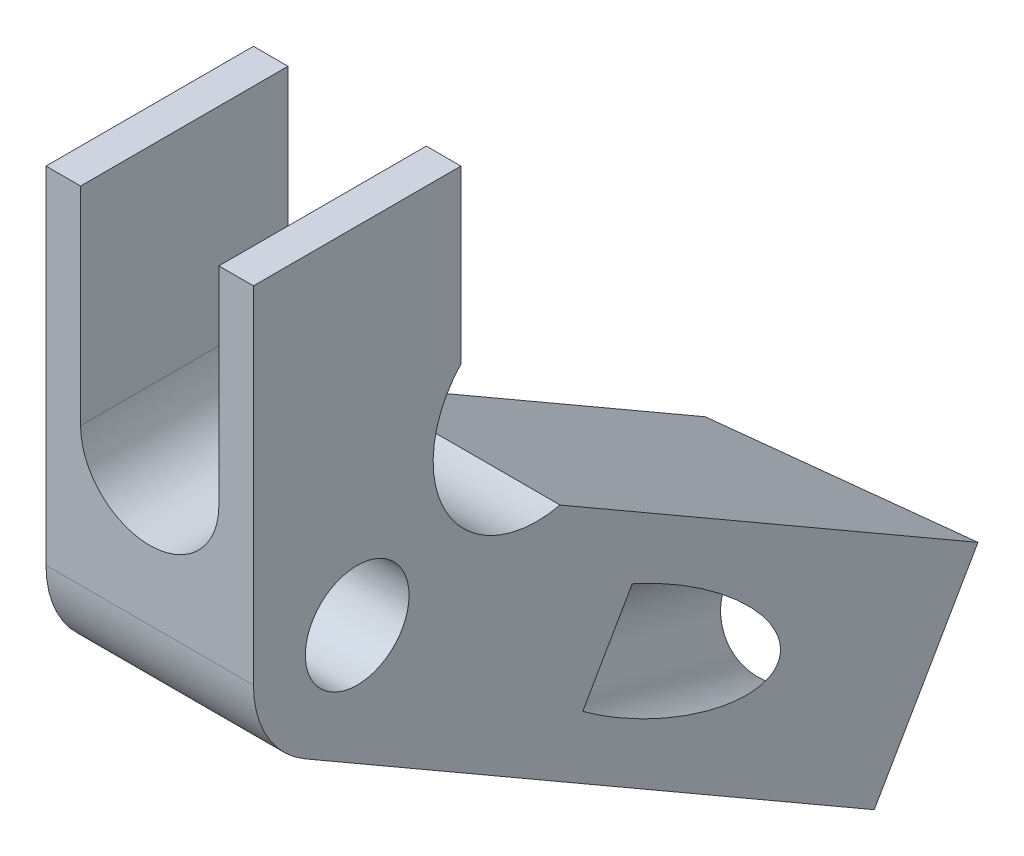
ISO-10303-21;
HEADER;
FILE_DESCRIPTION(('STEP AP214'),'2;1');
FILE_NAME('part.step','',(''),(''),'','','');
FILE_SCHEMA(('AUTOMOTIVE_DESIGN { 1 0 10303 214 1 1 1 1 }'));
ENDSEC;
DATA;
#1=APPLICATION_CONTEXT('core data for automotive mechanical design processes');
#2=APPLICATION_PROTOCOL_DEFINITION('international standard','automotive_design',2000,#1);
#3=PRODUCT_CONTEXT('',#1,'mechanical');
#4=PRODUCT('Part','Part','',(#3));
#5=PRODUCT_RELATED_PRODUCT_CATEGORY('part','',(#4));
#6=PRODUCT_DEFINITION_FORMATION('','',#4);
#7=PRODUCT_DEFINITION_CONTEXT('part definition',#1,'design');
#8=PRODUCT_DEFINITION('design','',#6,#7);
#9=PRODUCT_DEFINITION_SHAPE('','',#8);
#10=(LENGTH_UNIT() NAMED_UNIT(*) SI_UNIT(.MILLI.,.METRE.));
#11=(NAMED_UNIT(*) PLANE_ANGLE_UNIT() SI_UNIT($,.RADIAN.));
#12=(NAMED_UNIT(*) SI_UNIT($,.STERADIAN.) SOLID_ANGLE_UNIT());
#13=UNCERTAINTY_MEASURE_WITH_UNIT(LENGTH_MEASURE(1.E-05),#10,'distance_accuracy_value','');
#14=(GEOMETRIC_REPRESENTATION_CONTEXT(3) GLOBAL_UNCERTAINTY_ASSIGNED_CONTEXT((#13)) GLOBAL_UNIT_ASSIGNED_CONTEXT((#10,
#11,#12)) REPRESENTATION_CONTEXT('',''));
#15=CARTESIAN_POINT('',(0.,0.,0.));
#16=DIRECTION('',(0.,0.,1.));
#17=DIRECTION('',(1.,0.,0.));
#18=AXIS2_PLACEMENT_3D('',#15,#16,#17);
#19=CARTESIAN_POINT('',(-79.9999999999982,628.83201228621,-414.857743681078));
#20=DIRECTION('',(-1.11022302462414E-13,-1.,0.));
#21=DIRECTION('',(1.,-1.11022302462414E-13,0.));
#22=AXIS2_PLACEMENT_3D('',#19,#20,#21);
#23=PLANE('',#22);
#24=DIRECTION('',(1.,-1.11022302462414E-13,0.));
#25=VECTOR('',#24,1.);
#26=CARTESIAN_POINT('',(-79.9999999999982,628.83201228621,-408.857743681078));
#27=LINE('',#26,#25);
#28=CARTESIAN_POINT('',(-78.9999999999983,628.83201228621,-408.857743681078));
#29=VERTEX_POINT('',#28);
#30=CARTESIAN_POINT('',(-79.9999999999977,628.832012286211,-408.857743681078));
#31=VERTEX_POINT('',#30);
#32=EDGE_CURVE('E194',#29,#31,#27,.F.);
#33=ORIENTED_EDGE('',*,*,#32,.F.);
#34=DIRECTION('',(-1.48330561201754E-13,0.,1.));
#35=VECTOR('',#34,1.);
#36=CARTESIAN_POINT('',(-78.9999999999949,628.83201228621,-439.380974039878));
#37=LINE('',#36,#35);
#38=CARTESIAN_POINT('',(-78.9999999999985,628.83201228621,-414.857743681078));
#39=VERTEX_POINT('',#38);
#40=EDGE_CURVE('E133',#29,#39,#37,.F.);
#41=ORIENTED_EDGE('',*,*,#40,.T.);
#42=DIRECTION('',(1.,0.,0.));
#43=VECTOR('',#42,1.);
#44=CARTESIAN_POINT('',(-78.9999999999965,628.83201228621,-414.857743681077));
#45=LINE('',#44,#43);
#46=CARTESIAN_POINT('',(-79.9999999999977,628.832012286211,-414.857743681078));
#47=VERTEX_POINT('',#46);
#48=EDGE_CURVE('E192',#39,#47,#45,.F.);
#49=ORIENTED_EDGE('',*,*,#48,.T.);
#50=DIRECTION('',(0.,0.,-1.));
#51=VECTOR('',#50,1.);
#52=CARTESIAN_POINT('',(-79.9999999999977,628.832012286212,-411.857743681078));
#53=LINE('',#52,#51);
#54=EDGE_CURVE('E165',#47,#31,#53,.F.);
#55=ORIENTED_EDGE('',*,*,#54,.T.);
#56=EDGE_LOOP('',(#33,#41,#49,#55));
#57=FACE_BOUND('',#56,.T.);
#58=ADVANCED_FACE('F17',(#57),#23,.F.);
#59=CARTESIAN_POINT('',(-78.9999999999965,628.832012286212,-414.857743681077));
#60=DIRECTION('',(0.,0.,1.));
#61=DIRECTION('',(1.,0.,0.));
#62=AXIS2_PLACEMENT_3D('',#59,#60,#61);
#63=PLANE('',#62);
#64=DIRECTION('',(0.,1.,0.));
#65=VECTOR('',#64,1.);
#66=CARTESIAN_POINT('',(-79.9999999999977,624.832012286211,-414.857743681078));
#67=LINE('',#66,#65);
#68=CARTESIAN_POINT('',(-79.9999999999977,623.875762402111,-414.857743681078));
#69=VERTEX_POINT('',#68);
#70=EDGE_CURVE('E124',#69,#47,#67,.T.);
#71=ORIENTED_EDGE('',*,*,#70,.T.);
#72=ORIENTED_EDGE('',*,*,#48,.F.);
#73=DIRECTION('',(0.,1.,0.));
#74=VECTOR('',#73,1.);
#75=CARTESIAN_POINT('',(-78.9999999999983,623.307493233372,-414.857743681078));
#76=LINE('',#75,#74);
#77=CARTESIAN_POINT('',(-78.9999999999982,623.875762402111,-414.857743681078));
#78=VERTEX_POINT('',#77);
#79=EDGE_CURVE('E130',#39,#78,#76,.F.);
#80=ORIENTED_EDGE('',*,*,#79,.T.);
#81=DIRECTION('',(1.,0.,0.));
#82=VECTOR('',#81,1.);
#83=CARTESIAN_POINT('',(-78.9999999999965,623.875762402111,-414.857743681077));
#84=LINE('',#83,#82);
#85=EDGE_CURVE('E125',#69,#78,#84,.T.);
#86=ORIENTED_EDGE('',*,*,#85,.F.);
#87=EDGE_LOOP('',(#71,#72,#80,#86));
#88=FACE_BOUND('',#87,.T.);
#89=ADVANCED_FACE('F379',(#88),#63,.F.);
#90=CARTESIAN_POINT('',(-80.2786319766951,616.125564871041,-419.409040166123));
#91=DIRECTION('',(0.34202014332566,0.469846310392991,0.813797681349356));
#92=DIRECTION('',(0.,-0.866025403784417,0.500000000000038));
#93=AXIS2_PLACEMENT_3D('',#90,#91,#92);
#94=PLANE('',#93);
#95=CARTESIAN_POINT('',(-78.5797985667409,614.576430741539,-419.2286271322));
#96=DIRECTION('',(0.342020143325571,0.469846310392962,0.813797681349411));
#97=DIRECTION('',(0.,-0.866025403784445,0.499999999999989));
#98=AXIS2_PLACEMENT_3D('',#95,#96,#97);
#99=CIRCLE('',#98,1.50000000000003);
#100=CARTESIAN_POINT('',(-78.9999999999975,613.412929416189,-418.380278488423));
#101=VERTEX_POINT('',#100);
#102=CARTESIAN_POINT('',(-78.9999999999974,615.892872880991,-419.812074515402));
#103=VERTEX_POINT('',#102);
#104=EDGE_CURVE('E20',#101,#103,#99,.F.);
#105=ORIENTED_EDGE('',*,*,#104,.T.);
#106=DIRECTION('',(0.,-0.866025403784278,0.500000000000279));
#107=VECTOR('',#106,1.);
#108=CARTESIAN_POINT('',(-78.9999999999974,615.892872880991,-419.812074515403));
#109=LINE('',#108,#107);
#110=EDGE_CURVE('E122',#103,#101,#109,.T.);
#111=ORIENTED_EDGE('',*,*,#110,.T.);
#112=EDGE_LOOP('',(#105,#111));
#113=FACE_BOUND('',#112,.T.);
#114=ADVANCED_FACE('F121',(#113),#94,.F.);
#115=CARTESIAN_POINT('',(-82.5823875322111,609.077919340544,-428.752328244721));
#116=DIRECTION('',(0.342020143325571,0.469846310392962,0.813797681349411));
#117=DIRECTION('',(0.,-0.866025403784445,0.499999999999989));
#118=AXIS2_PLACEMENT_3D('',#115,#116,#117);
#119=CYLINDRICAL_SURFACE('',#118,1.50000000000003);
#120=CARTESIAN_POINT('',(-81.9999999999965,609.87796763761,-427.366603945694));
#121=DIRECTION('',(0.342020143325571,0.469846310392962,0.813797681349411));
#122=DIRECTION('',(0.,-0.866025403784445,0.499999999999989));
#123=AXIS2_PLACEMENT_3D('',#120,#121,#122);
#124=CIRCLE('',#123,1.50000000000003);
#125=CARTESIAN_POINT('',(-81.9999999999965,608.578929531933,-426.616603945694));
#126=VERTEX_POINT('',#125);
#127=EDGE_CURVE('E177',#126,#126,#124,.F.);
#128=ORIENTED_EDGE('',*,*,#127,.T.);
#129=EDGE_LOOP('',(#128));
#130=FACE_BOUND('',#129,.T.);
#131=ORIENTED_EDGE('',*,*,#104,.F.);
#132=CARTESIAN_POINT('',(-78.9999999999973,613.999183766792,-420.228448220978));
#133=DIRECTION('',(-1.,0.,-1.48330561201754E-13));
#134=DIRECTION('',(-1.42598801447091E-13,0.500000000000005,0.866025403784436));
#135=AXIS2_PLACEMENT_3D('',#132,#133,#134);
#136=ELLIPSE('',#135,4.38570660024426,1.50000000000003);
#137=EDGE_CURVE('E116',#101,#103,#136,.F.);
#138=ORIENTED_EDGE('',*,*,#137,.T.);
#139=EDGE_LOOP('',(#131,#138));
#140=FACE_BOUND('',#139,.T.);
#141=ADVANCED_FACE('F126',(#130,#140),#119,.F.);
#142=CARTESIAN_POINT('',(-81.9999999999979,622.832012286212,-414.225990272058));
#143=DIRECTION('',(0.,-1.17756934401283E-13,1.));
#144=DIRECTION('',(0.,-1.,-1.17756934401283E-13));
#145=AXIS2_PLACEMENT_3D('',#142,#143,#144);
#146=CYLINDRICAL_SURFACE('',#145,1.99999999999999);
#147=DIRECTION('',(0.,0.,-1.));
#148=VECTOR('',#147,1.);
#149=CARTESIAN_POINT('',(-83.9999999999977,622.832012286211,-411.857743681078));
#150=LINE('',#149,#148);
#151=CARTESIAN_POINT('',(-83.9999999999977,622.832012286211,-408.857743681078));
#152=VERTEX_POINT('',#151);
#153=CARTESIAN_POINT('',(-83.9999999999978,622.832012286211,-414.225468979037));
#154=VERTEX_POINT('',#153);
#155=EDGE_CURVE('E151',#152,#154,#150,.T.);
#156=ORIENTED_EDGE('',*,*,#155,.F.);
#157=CARTESIAN_POINT('',(-81.9999999999977,622.832012286211,-408.857743681078));
#158=DIRECTION('',(0.,-1.17756934401283E-13,1.));
#159=DIRECTION('',(0.,-1.,-1.17756934401283E-13));
#160=AXIS2_PLACEMENT_3D('',#157,#158,#159);
#161=CIRCLE('',#160,1.99999999999999);
#162=CARTESIAN_POINT('',(-79.9999999999977,622.832012286211,-408.857743681078));
#163=VERTEX_POINT('',#162);
#164=EDGE_CURVE('E213',#152,#163,#161,.T.);
#165=ORIENTED_EDGE('',*,*,#164,.T.);
#166=DIRECTION('',(0.,0.,-1.));
#167=VECTOR('',#166,1.);
#168=CARTESIAN_POINT('',(-79.9999999999977,622.832012286211,-411.857743681078));
#169=LINE('',#168,#167);
#170=CARTESIAN_POINT('',(-79.9999999999976,622.832012286212,-414.225468979037));
#171=VERTEX_POINT('',#170);
#172=EDGE_CURVE('E154',#163,#171,#169,.T.);
#173=ORIENTED_EDGE('',*,*,#172,.T.);
#174=CARTESIAN_POINT('',(-79.9999999999979,622.832012286212,-414.225468979037));
#175=CARTESIAN_POINT('',(-79.9999923927773,622.786099504914,-414.20922693826));
#176=CARTESIAN_POINT('',(-80.0015810610381,622.739779367858,-414.194117367747));
#177=CARTESIAN_POINT('',(-80.0080618061391,622.646666474156,-414.166217578955));
#178=CARTESIAN_POINT('',(-80.0129544516055,622.599873637522,-414.153427760394));
#179=CARTESIAN_POINT('',(-80.02613662331,622.50629745751,-414.130258214111));
#180=CARTESIAN_POINT('',(-80.0344171266361,622.459514416658,-414.119872198483));
#181=CARTESIAN_POINT('',(-80.0544070623554,622.366235872188,-414.101461535702));
#182=CARTESIAN_POINT('',(-80.0661161116991,622.31974033704,-414.093436624959));
#183=CARTESIAN_POINT('',(-80.1064442853904,622.181100554614,-414.0728162894));
#184=CARTESIAN_POINT('',(-80.1402549662716,622.089871931673,-414.063691936967));
#185=CARTESIAN_POINT('',(-80.2209722698522,621.913028692408,-414.053677662792));
#186=CARTESIAN_POINT('',(-80.2678785723979,621.827413938902,-414.052787539763));
#187=CARTESIAN_POINT('',(-80.3737839743252,621.663693299303,-414.057496872334));
#188=CARTESIAN_POINT('',(-80.4328379599443,621.585623944887,-414.06312633921));
#189=CARTESIAN_POINT('',(-80.5614416370611,621.439149809683,-414.078816522753));
#190=CARTESIAN_POINT('',(-80.6309987683427,621.370751946624,-414.088880390246));
#191=CARTESIAN_POINT('',(-80.7865957674182,621.238558594152,-414.112337444942));
#192=CARTESIAN_POINT('',(-80.8735910689381,621.175927415409,-414.125964354566));
#193=CARTESIAN_POINT('',(-81.0564939835348,621.065312893658,-414.152961329818));
#194=CARTESIAN_POINT('',(-81.1524038698318,621.017333300247,-414.166331328879));
#195=CARTESIAN_POINT('',(-81.3568541049223,620.934855286138,-414.190841321417));
#196=CARTESIAN_POINT('',(-81.4658053988202,620.901313710196,-414.201804309487));
#197=CARTESIAN_POINT('',(-81.6882156617346,620.853194313364,-414.217952513736));
#198=CARTESIAN_POINT('',(-81.8016724395332,620.83860738762,-414.223140503761));
#199=CARTESIAN_POINT('',(-82.0243670309518,620.829198485351,-414.226461943504));
#200=CARTESIAN_POINT('',(-82.1335643713183,620.833514852216,-414.22490297463));
#201=CARTESIAN_POINT('',(-82.3495455355692,620.859791294264,-414.215767486834));
#202=CARTESIAN_POINT('',(-82.4563292440566,620.881752211215,-414.20819068082));
#203=CARTESIAN_POINT('',(-82.662778704478,620.942011899661,-414.188783528599));
#204=CARTESIAN_POINT('',(-82.7625336280588,620.980031306569,-414.177026434607));
#205=CARTESIAN_POINT('',(-82.9545859014669,621.071307210785,-414.151557896413));
#206=CARTESIAN_POINT('',(-83.0468787719568,621.124572774266,-414.137845291802));
#207=CARTESIAN_POINT('',(-83.2268836599913,621.248549271927,-414.110460457573));
#208=CARTESIAN_POINT('',(-83.3140446641164,621.320073981998,-414.096834026263));
#209=CARTESIAN_POINT('',(-83.4753802338253,621.477051788792,-414.073914599433));
#210=CARTESIAN_POINT('',(-83.5495623838502,621.562496694222,-414.064619067751));
#211=CARTESIAN_POINT('',(-83.681461480571,621.743458602044,-414.053866756312));
#212=CARTESIAN_POINT('',(-83.7394568488569,621.838760794184,-414.052268575658));
#213=CARTESIAN_POINT('',(-83.8138554382193,621.987601984297,-414.057518467597));
#214=CARTESIAN_POINT('',(-83.8365633023408,622.038221241239,-414.0605460582));
#215=CARTESIAN_POINT('',(-83.8776264563152,622.140948306037,-414.069401582645));
#216=CARTESIAN_POINT('',(-83.8959840784562,622.193055299408,-414.075228010856));
#217=CARTESIAN_POINT('',(-83.9269339656444,622.293974448478,-414.089275510967));
#218=CARTESIAN_POINT('',(-83.9398717130414,622.34271356715,-414.097265661875));
#219=CARTESIAN_POINT('',(-83.9619579853784,622.440558483497,-414.115843765194));
#220=CARTESIAN_POINT('',(-83.9711063391058,622.489664297639,-414.12643183495));
#221=CARTESIAN_POINT('',(-83.9856783185255,622.587968605804,-414.150261720764));
#222=CARTESIAN_POINT('',(-83.9910886273056,622.637166811413,-414.163512809784));
#223=CARTESIAN_POINT('',(-83.9982542952328,622.735064946593,-414.192581543424));
#224=CARTESIAN_POINT('',(-84.0000100018796,622.783764923099,-414.208398943871));
#225=CARTESIAN_POINT('',(-83.9999999999979,622.832012286211,-414.225468979036));
#226=B_SPLINE_CURVE_WITH_KNOTS('',3,(#174,#175,#176,#177,#178,#179,#180,#181,#182,#183,#184,
#185,#186,#187,#188,#189,#190,#191,#192,#193,#194,#195,#196,#197,#198,#199,#200,#201,#202,#203,
#204,#205,#206,#207,#208,#209,#210,#211,#212,#213,#214,#215,#216,#217,#218,#219,#220,#221,#222,
#223,#224,#225),.UNSPECIFIED.,.F.,.F.,(4,2,2,2,2,2,2,2,2,2,2,2,2,2,2,2,2,2,2,2,2,2,2,2,2,4),(0.,
0.146070999313893,0.292167144372815,0.437876697239287,0.583569977119144,0.875167967485926,
1.16675882966946,1.45969730938428,1.75284427065252,2.07562682745906,2.39849192086012,
2.74031218687063,3.08196819896699,3.4082168702428,3.73448110677642,4.05528912936019,
4.37628831917504,4.7153720149479,5.05425689400982,5.38689205305369,5.55336016888875,
5.71973883349663,5.87270427697923,6.02567663099923,6.17919118254871,6.33269113641883),.UNSPECIFIED.);
#227=EDGE_CURVE('E222',#171,#154,#226,.T.);
#228=ORIENTED_EDGE('',*,*,#227,.T.);
#229=EDGE_LOOP('',(#156,#165,#173,#228));
#230=FACE_BOUND('',#229,.T.);
#231=ADVANCED_FACE('F232',(#230),#146,.F.);
#232=CARTESIAN_POINT('',(-79.9999999999977,624.832012286211,-411.857743681078));
#233=DIRECTION('',(1.,0.,0.));
#234=DIRECTION('',(0.,0.,-1.));
#235=AXIS2_PLACEMENT_3D('',#232,#233,#234);
#236=PLANE('',#235);
#237=ORIENTED_EDGE('',*,*,#172,.F.);
#238=DIRECTION('',(0.,1.,0.));
#239=VECTOR('',#238,1.);
#240=CARTESIAN_POINT('',(-79.9999999999977,618.832012286209,-408.857743681078));
#241=LINE('',#240,#239);
#242=EDGE_CURVE('E158',#163,#31,#241,.T.);
#243=ORIENTED_EDGE('',*,*,#242,.T.);
#244=ORIENTED_EDGE('',*,*,#54,.F.);
#245=ORIENTED_EDGE('',*,*,#70,.F.);
#246=CARTESIAN_POINT('',(-79.9999999999977,621.832012286209,-417.053896103782));
#247=DIRECTION('',(1.,0.,0.));
#248=DIRECTION('',(0.,0.,-1.));
#249=AXIS2_PLACEMENT_3D('',#246,#247,#248);
#250=CIRCLE('',#249,3.);
#251=EDGE_CURVE('E230',#69,#171,#250,.T.);
#252=ORIENTED_EDGE('',*,*,#251,.T.);
#253=EDGE_LOOP('',(#237,#243,#244,#245,#252));
#254=FACE_BOUND('',#253,.T.);
#255=ADVANCED_FACE('F249',(#254),#236,.F.);
#256=CARTESIAN_POINT('',(-83.9999999999977,624.832012286212,-411.857743681078));
#257=DIRECTION('',(1.,0.,0.));
#258=DIRECTION('',(0.,0.,-1.));
#259=AXIS2_PLACEMENT_3D('',#256,#257,#258);
#260=PLANE('',#259);
#261=DIRECTION('',(0.,1.,0.));
#262=VECTOR('',#261,1.);
#263=CARTESIAN_POINT('',(-83.9999999999977,618.832012286209,-408.857743681078));
#264=LINE('',#263,#262);
#265=CARTESIAN_POINT('',(-83.9999999999977,628.832012286211,-408.857743681078));
#266=VERTEX_POINT('',#265);
#267=EDGE_CURVE('E348',#266,#152,#264,.F.);
#268=ORIENTED_EDGE('',*,*,#267,.T.);
#269=ORIENTED_EDGE('',*,*,#155,.T.);
#270=CARTESIAN_POINT('',(-83.9999999999977,621.832012286209,-417.053896103782));
#271=DIRECTION('',(1.,0.,0.));
#272=DIRECTION('',(0.,0.,-1.));
#273=AXIS2_PLACEMENT_3D('',#270,#271,#272);
#274=CIRCLE('',#273,3.);
#275=CARTESIAN_POINT('',(-83.9999999999977,623.875762402111,-414.857743681078));
#276=VERTEX_POINT('',#275);
#277=EDGE_CURVE('E188',#154,#276,#274,.F.);
#278=ORIENTED_EDGE('',*,*,#277,.T.);
#279=DIRECTION('',(0.,1.,0.));
#280=VECTOR('',#279,1.);
#281=CARTESIAN_POINT('',(-83.9999999999977,628.832012286212,-414.857743681078));
#282=LINE('',#281,#280);
#283=CARTESIAN_POINT('',(-83.9999999999977,628.832012286211,-414.857743681078));
#284=VERTEX_POINT('',#283);
#285=EDGE_CURVE('E141',#276,#284,#282,.T.);
#286=ORIENTED_EDGE('',*,*,#285,.T.);
#287=DIRECTION('',(0.,0.,1.));
#288=VECTOR('',#287,1.);
#289=CARTESIAN_POINT('',(-83.9999999999977,628.832012286211,-414.857743681078));
#290=LINE('',#289,#288);
#291=EDGE_CURVE('E143',#284,#266,#290,.T.);
#292=ORIENTED_EDGE('',*,*,#291,.T.);
#293=EDGE_LOOP('',(#268,#269,#278,#286,#292));
#294=FACE_BOUND('',#293,.T.);
#295=ADVANCED_FACE('F246',(#294),#260,.T.);
#296=CARTESIAN_POINT('',(-78.9999999999947,623.307493233372,-439.380974039878));
#297=DIRECTION('',(-1.,0.,-1.48330561201754E-13));
#298=DIRECTION('',(-1.48330561201754E-13,0.,1.));
#299=AXIS2_PLACEMENT_3D('',#296,#297,#298);
#300=PLANE('',#299);
#301=CARTESIAN_POINT('',(-78.9999999999987,618.832012286212,-411.857743681078));
#302=DIRECTION('',(1.,0.,0.));
#303=DIRECTION('',(0.,0.,-1.));
#304=AXIS2_PLACEMENT_3D('',#301,#302,#303);
#305=CIRCLE('',#304,1.50000000000002);
#306=CARTESIAN_POINT('',(-78.9999999999986,618.832012286212,-413.357743681078));
#307=VERTEX_POINT('',#306);
#308=EDGE_CURVE('E209',#307,#307,#305,.F.);
#309=ORIENTED_EDGE('',*,*,#308,.T.);
#310=EDGE_LOOP('',(#309));
#311=FACE_BOUND('',#310,.T.);
#312=ORIENTED_EDGE('',*,*,#137,.F.);
#313=ORIENTED_EDGE('',*,*,#110,.F.);
#314=EDGE_LOOP('',(#312,#313));
#315=FACE_BOUND('',#314,.T.);
#316=ORIENTED_EDGE('',*,*,#79,.F.);
#317=ORIENTED_EDGE('',*,*,#40,.F.);
#318=DIRECTION('',(0.,1.,0.));
#319=VECTOR('',#318,1.);
#320=CARTESIAN_POINT('',(-78.9999999999977,618.832012286209,-408.857743681078));
#321=LINE('',#320,#319);
#322=CARTESIAN_POINT('',(-78.9999999999986,618.832012286209,-408.857743681078));
#323=VERTEX_POINT('',#322);
#324=EDGE_CURVE('E155',#29,#323,#321,.F.);
#325=ORIENTED_EDGE('',*,*,#324,.T.);
#326=CARTESIAN_POINT('',(-78.9999999999994,618.83201228621,-411.857743681078));
#327=DIRECTION('',(-1.,0.,0.));
#328=DIRECTION('',(0.,0.,1.));
#329=AXIS2_PLACEMENT_3D('',#326,#327,#328);
#330=CIRCLE('',#329,3.00000000000013);
#331=CARTESIAN_POINT('',(-78.9999999999995,616.233936074856,-410.357743681078));
#332=VERTEX_POINT('',#331);
#333=EDGE_CURVE('E215',#332,#323,#330,.T.);
#334=ORIENTED_EDGE('',*,*,#333,.F.);
#335=DIRECTION('',(0.,0.500000000000003,0.866025403784437));
#336=VECTOR('',#335,1.);
#337=CARTESIAN_POINT('',(-78.9999999999995,606.733936074857,-426.81222635298));
#338=LINE('',#337,#336);
#339=CARTESIAN_POINT('',(-78.9999999999987,606.733936074857,-426.812226352979));
#340=VERTEX_POINT('',#339);
#341=EDGE_CURVE('E174',#332,#340,#338,.F.);
#342=ORIENTED_EDGE('',*,*,#341,.T.);
#343=DIRECTION('',(0.,-0.866025403784449,0.499999999999982));
#344=VECTOR('',#343,1.);
#345=CARTESIAN_POINT('',(-78.9999999999971,612.749021524663,-430.285037556625));
#346=LINE('',#345,#344);
#347=CARTESIAN_POINT('',(-78.999999999997,611.930088497564,-429.81222635298));
#348=VERTEX_POINT('',#347);
#349=EDGE_CURVE('E180',#340,#348,#346,.F.);
#350=ORIENTED_EDGE('',*,*,#349,.T.);
#351=DIRECTION('',(0.,-0.5,-0.866025403784438));
#352=VECTOR('',#351,1.);
#353=CARTESIAN_POINT('',(-78.9999999999968,611.930088497564,-429.812226352981));
#354=LINE('',#353,#352);
#355=CARTESIAN_POINT('',(-78.9999999999975,618.908213439613,-417.725759411788));
#356=VERTEX_POINT('',#355);
#357=EDGE_CURVE('E186',#348,#356,#354,.F.);
#358=ORIENTED_EDGE('',*,*,#357,.T.);
#359=CARTESIAN_POINT('',(-78.9999999999982,621.832012286209,-417.053896103782));
#360=DIRECTION('',(1.,0.,0.));
#361=DIRECTION('',(0.,0.,-1.));
#362=AXIS2_PLACEMENT_3D('',#359,#360,#361);
#363=CIRCLE('',#362,3.);
#364=EDGE_CURVE('E127',#356,#78,#363,.F.);
#365=ORIENTED_EDGE('',*,*,#364,.T.);
#366=EDGE_LOOP('',(#316,#317,#325,#334,#342,#350,#358,#365));
#367=FACE_BOUND('',#366,.T.);
#368=ADVANCED_FACE('F128',(#311,#315,#367),#300,.F.);
#369=CARTESIAN_POINT('',(-82.9999999999987,621.832012286209,-417.053896103782));
#370=DIRECTION('',(1.,0.,0.));
#371=DIRECTION('',(0.,0.,-1.));
#372=AXIS2_PLACEMENT_3D('',#369,#370,#371);
#373=CYLINDRICAL_SURFACE('',#372,3.);
#374=DIRECTION('',(1.,0.,0.));
#375=VECTOR('',#374,1.);
#376=CARTESIAN_POINT('',(-83.999999999997,623.875762402111,-414.857743681078));
#377=LINE('',#376,#375);
#378=CARTESIAN_POINT('',(-84.999999999998,623.875762402111,-414.857743681078));
#379=VERTEX_POINT('',#378);
#380=EDGE_CURVE('E212',#379,#276,#377,.T.);
#381=ORIENTED_EDGE('',*,*,#380,.T.);
#382=ORIENTED_EDGE('',*,*,#277,.F.);
#383=ORIENTED_EDGE('',*,*,#227,.F.);
#384=ORIENTED_EDGE('',*,*,#251,.F.);
#385=ORIENTED_EDGE('',*,*,#85,.T.);
#386=ORIENTED_EDGE('',*,*,#364,.F.);
#387=DIRECTION('',(1.,0.,0.));
#388=VECTOR('',#387,1.);
#389=CARTESIAN_POINT('',(-84.9999999999979,618.908213439613,-417.725759411788));
#390=LINE('',#389,#388);
#391=CARTESIAN_POINT('',(-84.9999999999976,618.908213439613,-417.725759411788));
#392=VERTEX_POINT('',#391);
#393=EDGE_CURVE('E136',#356,#392,#390,.F.);
#394=ORIENTED_EDGE('',*,*,#393,.T.);
#395=CARTESIAN_POINT('',(-84.9999999999977,621.832012286209,-417.053896103782));
#396=DIRECTION('',(1.,0.,0.));
#397=DIRECTION('',(0.,0.,-1.));
#398=AXIS2_PLACEMENT_3D('',#395,#396,#397);
#399=CIRCLE('',#398,3.);
#400=EDGE_CURVE('E205',#379,#392,#399,.T.);
#401=ORIENTED_EDGE('',*,*,#400,.F.);
#402=EDGE_LOOP('',(#381,#382,#383,#384,#385,#386,#394,#401));
#403=FACE_BOUND('',#402,.T.);
#404=ADVANCED_FACE('F236',(#403),#373,.F.);
#405=CARTESIAN_POINT('',(-84.9999999999979,611.930088497564,-429.812226352981));
#406=DIRECTION('',(0.,-0.866025403784438,0.5));
#407=DIRECTION('',(0.,-0.5,-0.866025403784438));
#408=AXIS2_PLACEMENT_3D('',#405,#406,#407);
#409=PLANE('',#408);
#410=ORIENTED_EDGE('',*,*,#357,.F.);
#411=DIRECTION('',(0.939692620785963,-0.171010071662753,-0.296198132725897));
#412=VECTOR('',#411,1.);
#413=CARTESIAN_POINT('',(-85.8350055988369,613.173957792073,-427.657781536915));
#414=LINE('',#413,#412);
#415=CARTESIAN_POINT('',(-84.9999999999961,613.021999200363,-427.920981538406));
#416=VERTEX_POINT('',#415);
#417=EDGE_CURVE('E183',#348,#416,#414,.F.);
#418=ORIENTED_EDGE('',*,*,#417,.T.);
#419=DIRECTION('',(1.4381825429183E-13,-0.499999999999975,-0.866025403784453));
#420=VECTOR('',#419,1.);
#421=CARTESIAN_POINT('',(-84.9999999999977,618.908213439613,-417.725759411789));
#422=LINE('',#421,#420);
#423=EDGE_CURVE('E208',#392,#416,#422,.T.);
#424=ORIENTED_EDGE('',*,*,#423,.F.);
#425=ORIENTED_EDGE('',*,*,#393,.F.);
#426=EDGE_LOOP('',(#410,#418,#424,#425));
#427=FACE_BOUND('',#426,.T.);
#428=ADVANCED_FACE('F241',(#427),#409,.F.);
#429=CARTESIAN_POINT('',(-85.8350055988369,613.992890819173,-428.130592740559));
#430=DIRECTION('',(0.342020143325518,0.469846310392965,0.813797681349431));
#431=DIRECTION('',(0.,-0.866025403784449,0.499999999999982));
#432=AXIS2_PLACEMENT_3D('',#429,#430,#431);
#433=PLANE('',#432);
#434=ORIENTED_EDGE('',*,*,#127,.F.);
#435=EDGE_LOOP('',(#434));
#436=FACE_BOUND('',#435,.T.);
#437=DIRECTION('',(-0.939692620786028,0.171010071662703,0.296198132725721));
#438=VECTOR('',#437,1.);
#439=CARTESIAN_POINT('',(-78.9999999999968,606.733936074857,-426.81222635298));
#440=LINE('',#439,#438);
#441=CARTESIAN_POINT('',(-84.9999999999964,607.825846777655,-424.920981538406));
#442=VERTEX_POINT('',#441);
#443=EDGE_CURVE('E176',#340,#442,#440,.T.);
#444=ORIENTED_EDGE('',*,*,#443,.T.);
#445=DIRECTION('',(0.,-0.866025403784495,0.499999999999902));
#446=VECTOR('',#445,1.);
#447=CARTESIAN_POINT('',(-84.999999999996,613.021999200363,-427.920981538406));
#448=LINE('',#447,#446);
#449=EDGE_CURVE('E304',#416,#442,#448,.T.);
#450=ORIENTED_EDGE('',*,*,#449,.F.);
#451=ORIENTED_EDGE('',*,*,#417,.F.);
#452=ORIENTED_EDGE('',*,*,#349,.F.);
#453=EDGE_LOOP('',(#444,#450,#451,#452));
#454=FACE_BOUND('',#453,.T.);
#455=ADVANCED_FACE('F288',(#436,#454),#433,.F.);
#456=CARTESIAN_POINT('',(-78.9999999999941,606.733936074857,-426.81222635298));
#457=DIRECTION('',(0.,0.866025403784437,-0.500000000000003));
#458=DIRECTION('',(0.,0.500000000000003,0.866025403784437));
#459=AXIS2_PLACEMENT_3D('',#456,#457,#458);
#460=PLANE('',#459);
#461=ORIENTED_EDGE('',*,*,#443,.F.);
#462=ORIENTED_EDGE('',*,*,#341,.F.);
#463=DIRECTION('',(-1.,0.,0.));
#464=VECTOR('',#463,1.);
#465=CARTESIAN_POINT('',(-78.9999999999985,616.233936074857,-410.357743681078));
#466=LINE('',#465,#464);
#467=CARTESIAN_POINT('',(-84.9999999999987,616.233936074857,-410.357743681078));
#468=VERTEX_POINT('',#467);
#469=EDGE_CURVE('E218',#468,#332,#466,.F.);
#470=ORIENTED_EDGE('',*,*,#469,.F.);
#471=DIRECTION('',(-1.42770682249479E-13,0.500000000000046,0.866025403784412));
#472=VECTOR('',#471,1.);
#473=CARTESIAN_POINT('',(-84.9999999999964,607.825846777655,-424.920981538406));
#474=LINE('',#473,#472);
#475=EDGE_CURVE('E204',#442,#468,#474,.T.);
#476=ORIENTED_EDGE('',*,*,#475,.F.);
#477=EDGE_LOOP('',(#461,#462,#470,#476));
#478=FACE_BOUND('',#477,.T.);
#479=ADVANCED_FACE('F285',(#478),#460,.F.);
#480=CARTESIAN_POINT('',(-78.9999999999984,618.83201228621,-411.857743681078));
#481=DIRECTION('',(-1.,0.,0.));
#482=DIRECTION('',(0.,0.,1.));
#483=AXIS2_PLACEMENT_3D('',#480,#481,#482);
#484=CYLINDRICAL_SURFACE('',#483,3.00000000000013);
#485=ORIENTED_EDGE('',*,*,#333,.T.);
#486=DIRECTION('',(-1.,0.,0.));
#487=VECTOR('',#486,1.);
#488=CARTESIAN_POINT('',(-84.9999999999989,618.832012286209,-408.857743681078));
#489=LINE('',#488,#487);
#490=CARTESIAN_POINT('',(-84.9999999999988,618.83201228621,-408.857743681078));
#491=VERTEX_POINT('',#490);
#492=EDGE_CURVE('E157',#323,#491,#489,.T.);
#493=ORIENTED_EDGE('',*,*,#492,.T.);
#494=CARTESIAN_POINT('',(-84.9999999999985,618.83201228621,-411.857743681078));
#495=DIRECTION('',(-1.,0.,0.));
#496=DIRECTION('',(0.,0.,1.));
#497=AXIS2_PLACEMENT_3D('',#494,#495,#496);
#498=CIRCLE('',#497,3.00000000000013);
#499=EDGE_CURVE('E200',#468,#491,#498,.T.);
#500=ORIENTED_EDGE('',*,*,#499,.F.);
#501=ORIENTED_EDGE('',*,*,#469,.T.);
#502=EDGE_LOOP('',(#485,#493,#500,#501));
#503=FACE_BOUND('',#502,.T.);
#504=ADVANCED_FACE('F281',(#503),#484,.T.);
#505=CARTESIAN_POINT('',(-84.9999999999989,618.832012286209,-408.857743681078));
#506=DIRECTION('',(0.,0.,-1.));
#507=DIRECTION('',(-1.,0.,0.));
#508=AXIS2_PLACEMENT_3D('',#505,#506,#507);
#509=PLANE('',#508);
#510=DIRECTION('',(1.,-1.11022302462449E-13,0.));
#511=VECTOR('',#510,1.);
#512=CARTESIAN_POINT('',(-84.9999999999979,628.832012286211,-408.857743681078));
#513=LINE('',#512,#511);
#514=CARTESIAN_POINT('',(-84.9999999999993,628.832012286211,-408.857743681078));
#515=VERTEX_POINT('',#514);
#516=EDGE_CURVE('E148',#266,#515,#513,.F.);
#517=ORIENTED_EDGE('',*,*,#516,.T.);
#518=DIRECTION('',(0.,1.,0.));
#519=VECTOR('',#518,1.);
#520=CARTESIAN_POINT('',(-84.9999999999992,623.580470909072,-408.857743681078));
#521=LINE('',#520,#519);
#522=EDGE_CURVE('E203',#491,#515,#521,.T.);
#523=ORIENTED_EDGE('',*,*,#522,.F.);
#524=ORIENTED_EDGE('',*,*,#492,.F.);
#525=ORIENTED_EDGE('',*,*,#324,.F.);
#526=ORIENTED_EDGE('',*,*,#32,.T.);
#527=ORIENTED_EDGE('',*,*,#242,.F.);
#528=ORIENTED_EDGE('',*,*,#164,.F.);
#529=ORIENTED_EDGE('',*,*,#267,.F.);
#530=EDGE_LOOP('',(#517,#523,#524,#525,#526,#527,#528,#529));
#531=FACE_BOUND('',#530,.T.);
#532=ADVANCED_FACE('F278',(#531),#509,.F.);
#533=CARTESIAN_POINT('',(-84.9999999999979,628.832012286211,-414.857743681078));
#534=DIRECTION('',(-1.11022302462449E-13,-1.,0.));
#535=DIRECTION('',(1.,-1.11022302462449E-13,0.));
#536=AXIS2_PLACEMENT_3D('',#533,#534,#535);
#537=PLANE('',#536);
#538=DIRECTION('',(1.,0.,0.));
#539=VECTOR('',#538,1.);
#540=CARTESIAN_POINT('',(-83.999999999997,628.832012286211,-414.857743681078));
#541=LINE('',#540,#539);
#542=CARTESIAN_POINT('',(-84.9999999999985,628.832012286211,-414.857743681078));
#543=VERTEX_POINT('',#542);
#544=EDGE_CURVE('E35',#284,#543,#541,.F.);
#545=ORIENTED_EDGE('',*,*,#544,.T.);
#546=DIRECTION('',(-1.48718652168811E-13,0.,1.));
#547=VECTOR('',#546,1.);
#548=CARTESIAN_POINT('',(-84.9999999999952,628.832012286211,-437.016918021661));
#549=LINE('',#548,#547);
#550=EDGE_CURVE('E328',#515,#543,#549,.F.);
#551=ORIENTED_EDGE('',*,*,#550,.F.);
#552=ORIENTED_EDGE('',*,*,#516,.F.);
#553=ORIENTED_EDGE('',*,*,#291,.F.);
#554=EDGE_LOOP('',(#545,#551,#552,#553));
#555=FACE_BOUND('',#554,.T.);
#556=ADVANCED_FACE('F274',(#555),#537,.F.);
#557=CARTESIAN_POINT('',(-83.999999999997,628.832012286212,-414.857743681078));
#558=DIRECTION('',(0.,0.,1.));
#559=DIRECTION('',(1.,0.,0.));
#560=AXIS2_PLACEMENT_3D('',#557,#558,#559);
#561=PLANE('',#560);
#562=DIRECTION('',(0.,1.,0.));
#563=VECTOR('',#562,1.);
#564=CARTESIAN_POINT('',(-84.9999999999983,623.580470909072,-414.857743681078));
#565=LINE('',#564,#563);
#566=EDGE_CURVE('E26',#543,#379,#565,.F.);
#567=ORIENTED_EDGE('',*,*,#566,.F.);
#568=ORIENTED_EDGE('',*,*,#544,.F.);
#569=ORIENTED_EDGE('',*,*,#285,.F.);
#570=ORIENTED_EDGE('',*,*,#380,.F.);
#571=EDGE_LOOP('',(#567,#568,#569,#570));
#572=FACE_BOUND('',#571,.T.);
#573=ADVANCED_FACE('F267',(#572),#561,.F.);
#574=CARTESIAN_POINT('',(-84.9999999999988,618.832012286212,-411.857743681078));
#575=DIRECTION('',(1.,0.,0.));
#576=DIRECTION('',(0.,0.,-1.));
#577=AXIS2_PLACEMENT_3D('',#574,#575,#576);
#578=CYLINDRICAL_SURFACE('',#577,1.50000000000002);
#579=ORIENTED_EDGE('',*,*,#308,.F.);
#580=EDGE_LOOP('',(#579));
#581=FACE_BOUND('',#580,.T.);
#582=CARTESIAN_POINT('',(-84.9999999999987,618.832012286212,-411.857743681078));
#583=DIRECTION('',(1.,0.,0.));
#584=DIRECTION('',(0.,0.,-1.));
#585=AXIS2_PLACEMENT_3D('',#582,#583,#584);
#586=CIRCLE('',#585,1.50000000000002);
#587=CARTESIAN_POINT('',(-84.9999999999986,618.832012286212,-413.357743681078));
#588=VERTEX_POINT('',#587);
#589=EDGE_CURVE('E11',#588,#588,#586,.T.);
#590=ORIENTED_EDGE('',*,*,#589,.F.);
#591=EDGE_LOOP('',(#590));
#592=FACE_BOUND('',#591,.T.);
#593=ADVANCED_FACE('F261',(#581,#592),#578,.F.);
#594=CARTESIAN_POINT('',(-84.999999999995,623.580470909072,-437.016918021661));
#595=DIRECTION('',(-1.,0.,-1.48718652168811E-13));
#596=DIRECTION('',(-1.48718652168811E-13,0.,1.));
#597=AXIS2_PLACEMENT_3D('',#594,#595,#596);
#598=PLANE('',#597);
#599=ORIENTED_EDGE('',*,*,#589,.T.);
#600=EDGE_LOOP('',(#599));
#601=FACE_BOUND('',#600,.T.);
#602=ORIENTED_EDGE('',*,*,#550,.T.);
#603=ORIENTED_EDGE('',*,*,#566,.T.);
#604=ORIENTED_EDGE('',*,*,#400,.T.);
#605=ORIENTED_EDGE('',*,*,#423,.T.);
#606=ORIENTED_EDGE('',*,*,#449,.T.);
#607=ORIENTED_EDGE('',*,*,#475,.T.);
#608=ORIENTED_EDGE('',*,*,#499,.T.);
#609=ORIENTED_EDGE('',*,*,#522,.T.);
#610=EDGE_LOOP('',(#602,#603,#604,#605,#606,#607,#608,#609));
#611=FACE_BOUND('',#610,.T.);
#612=ADVANCED_FACE('F259',(#601,#611),#598,.T.);
#613=CLOSED_SHELL('',(#58,#89,#114,#141,#231,#255,#295,#368,#404,#428,#455,#479,#504,#532,#556,
#573,#593,#612));
#614=MANIFOLD_SOLID_BREP('B1',#613);
#615=ADVANCED_BREP_SHAPE_REPRESENTATION('',(#18,#614),#14);
#616=SHAPE_DEFINITION_REPRESENTATION(#9,#615);
ENDSEC;
END-ISO-10303-21;
